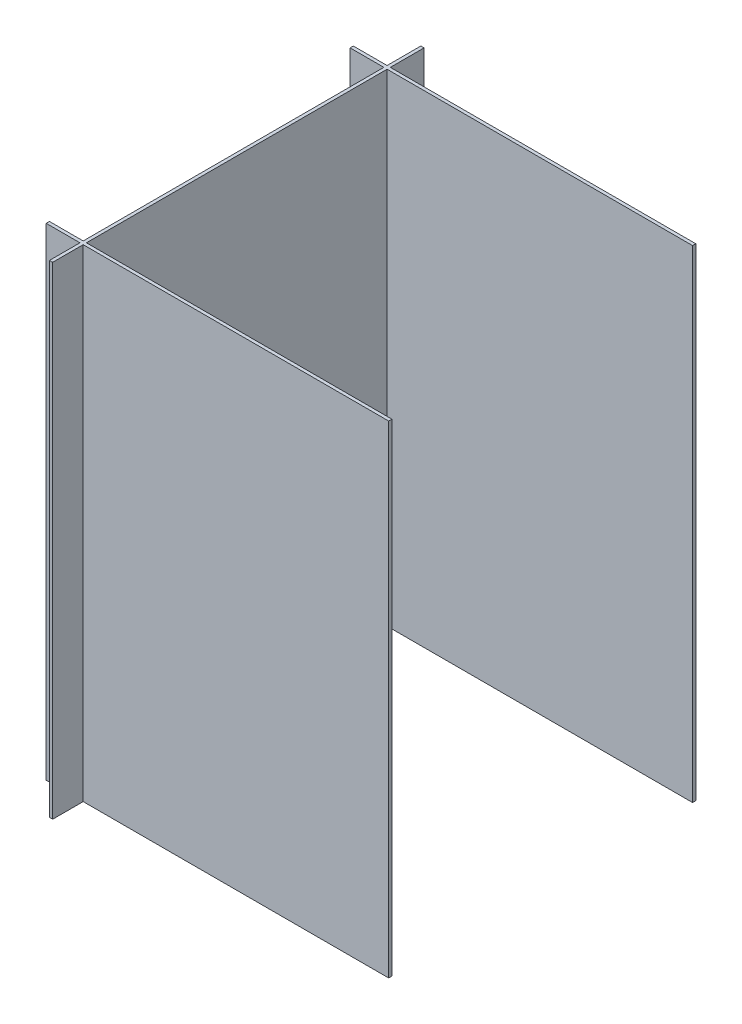
ISO-10303-21;
HEADER;
FILE_DESCRIPTION(('STEP AP214'),'2;1');
FILE_NAME('part.step','',(''),(''),'','','');
FILE_SCHEMA(('AUTOMOTIVE_DESIGN { 1 0 10303 214 1 1 1 1 }'));
ENDSEC;
DATA;
#1=APPLICATION_CONTEXT('core data for automotive mechanical design processes');
#2=APPLICATION_PROTOCOL_DEFINITION('international standard','automotive_design',2000,#1);
#3=PRODUCT_CONTEXT('',#1,'mechanical');
#4=PRODUCT('Part','Part','',(#3));
#5=PRODUCT_RELATED_PRODUCT_CATEGORY('part','',(#4));
#6=PRODUCT_DEFINITION_FORMATION('','',#4);
#7=PRODUCT_DEFINITION_CONTEXT('part definition',#1,'design');
#8=PRODUCT_DEFINITION('design','',#6,#7);
#9=PRODUCT_DEFINITION_SHAPE('','',#8);
#10=(LENGTH_UNIT() NAMED_UNIT(*) SI_UNIT(.MILLI.,.METRE.));
#11=(NAMED_UNIT(*) PLANE_ANGLE_UNIT() SI_UNIT($,.RADIAN.));
#12=(NAMED_UNIT(*) SI_UNIT($,.STERADIAN.) SOLID_ANGLE_UNIT());
#13=UNCERTAINTY_MEASURE_WITH_UNIT(LENGTH_MEASURE(1.E-05),#10,'distance_accuracy_value','');
#14=(GEOMETRIC_REPRESENTATION_CONTEXT(3) GLOBAL_UNCERTAINTY_ASSIGNED_CONTEXT((#13)) GLOBAL_UNIT_ASSIGNED_CONTEXT((#10,
#11,#12)) REPRESENTATION_CONTEXT('',''));
#15=CARTESIAN_POINT('',(0.,0.,0.));
#16=DIRECTION('',(0.,0.,1.));
#17=DIRECTION('',(1.,0.,0.));
#18=AXIS2_PLACEMENT_3D('',#15,#16,#17);
#19=CARTESIAN_POINT('',(-56.1616111521953,300.,42.3022668872637));
#20=DIRECTION('',(1.,0.,0.));
#21=DIRECTION('',(0.,0.,-1.));
#22=AXIS2_PLACEMENT_3D('',#19,#20,#21);
#23=PLANE('',#22);
#24=DIRECTION('',(0.,0.,1.));
#25=VECTOR('',#24,1.);
#26=CARTESIAN_POINT('',(-56.1616111521953,0.,42.3022668872637));
#27=LINE('',#26,#25);
#28=CARTESIAN_POINT('',(-56.1616111521953,0.,42.3022668872637));
#29=VERTEX_POINT('',#28);
#30=CARTESIAN_POINT('',(-56.1616111521953,0.,44.3022668872637));
#31=VERTEX_POINT('',#30);
#32=EDGE_CURVE('E214',#29,#31,#27,.T.);
#33=ORIENTED_EDGE('',*,*,#32,.T.);
#34=DIRECTION('',(0.,-1.,0.));
#35=VECTOR('',#34,1.);
#36=CARTESIAN_POINT('',(-56.1616111521953,300.,44.3022668872637));
#37=LINE('',#36,#35);
#38=CARTESIAN_POINT('',(-56.1616111521953,300.,44.3022668872637));
#39=VERTEX_POINT('',#38);
#40=EDGE_CURVE('E11',#39,#31,#37,.T.);
#41=ORIENTED_EDGE('',*,*,#40,.F.);
#42=DIRECTION('',(0.,0.,1.));
#43=VECTOR('',#42,1.);
#44=CARTESIAN_POINT('',(-56.1616111521953,300.,42.3022668872637));
#45=LINE('',#44,#43);
#46=CARTESIAN_POINT('',(-56.1616111521953,300.,42.3022668872637));
#47=VERTEX_POINT('',#46);
#48=EDGE_CURVE('E272',#47,#39,#45,.T.);
#49=ORIENTED_EDGE('',*,*,#48,.F.);
#50=DIRECTION('',(0.,-1.,0.));
#51=VECTOR('',#50,1.);
#52=CARTESIAN_POINT('',(-56.1616111521953,300.,42.3022668872637));
#53=LINE('',#52,#51);
#54=EDGE_CURVE('E210',#47,#29,#53,.T.);
#55=ORIENTED_EDGE('',*,*,#54,.T.);
#56=EDGE_LOOP('',(#33,#41,#49,#55));
#57=FACE_BOUND('',#56,.T.);
#58=ADVANCED_FACE('F41',(#57),#23,.F.);
#59=CARTESIAN_POINT('',(-56.1616111521953,300.,44.3022668872637));
#60=DIRECTION('',(0.,0.,-1.));
#61=DIRECTION('',(-1.,0.,0.));
#62=AXIS2_PLACEMENT_3D('',#59,#60,#61);
#63=PLANE('',#62);
#64=DIRECTION('',(1.,0.,0.));
#65=VECTOR('',#64,1.);
#66=CARTESIAN_POINT('',(-56.1616111521953,0.,44.3022668872637));
#67=LINE('',#66,#65);
#68=CARTESIAN_POINT('',(-35.1616111521953,0.,44.3022668872637));
#69=VERTEX_POINT('',#68);
#70=EDGE_CURVE('E218',#31,#69,#67,.T.);
#71=ORIENTED_EDGE('',*,*,#70,.T.);
#72=DIRECTION('',(0.,-1.,0.));
#73=VECTOR('',#72,1.);
#74=CARTESIAN_POINT('',(-35.1616111521953,300.,44.3022668872637));
#75=LINE('',#74,#73);
#76=CARTESIAN_POINT('',(-35.1616111521953,300.,44.3022668872637));
#77=VERTEX_POINT('',#76);
#78=EDGE_CURVE('E50',#77,#69,#75,.T.);
#79=ORIENTED_EDGE('',*,*,#78,.F.);
#80=DIRECTION('',(1.,0.,0.));
#81=VECTOR('',#80,1.);
#82=CARTESIAN_POINT('',(-56.1616111521953,300.,44.3022668872637));
#83=LINE('',#82,#81);
#84=EDGE_CURVE('E137',#39,#77,#83,.T.);
#85=ORIENTED_EDGE('',*,*,#84,.F.);
#86=ORIENTED_EDGE('',*,*,#40,.T.);
#87=EDGE_LOOP('',(#71,#79,#85,#86));
#88=FACE_BOUND('',#87,.T.);
#89=ADVANCED_FACE('F422',(#88),#63,.F.);
#90=CARTESIAN_POINT('',(-35.1616111521953,300.,44.3022668872637));
#91=DIRECTION('',(1.,0.,0.));
#92=DIRECTION('',(0.,0.,-1.));
#93=AXIS2_PLACEMENT_3D('',#90,#91,#92);
#94=PLANE('',#93);
#95=DIRECTION('',(0.,0.,1.));
#96=VECTOR('',#95,1.);
#97=CARTESIAN_POINT('',(-35.1616111521953,0.,44.3022668872637));
#98=LINE('',#97,#96);
#99=CARTESIAN_POINT('',(-35.1616111521953,0.,231.302266887264));
#100=VERTEX_POINT('',#99);
#101=EDGE_CURVE('E221',#69,#100,#98,.T.);
#102=ORIENTED_EDGE('',*,*,#101,.T.);
#103=DIRECTION('',(0.,-1.,0.));
#104=VECTOR('',#103,1.);
#105=CARTESIAN_POINT('',(-35.1616111521953,300.,231.302266887264));
#106=LINE('',#105,#104);
#107=CARTESIAN_POINT('',(-35.1616111521953,300.,231.302266887264));
#108=VERTEX_POINT('',#107);
#109=EDGE_CURVE('E331',#108,#100,#106,.T.);
#110=ORIENTED_EDGE('',*,*,#109,.F.);
#111=DIRECTION('',(0.,0.,1.));
#112=VECTOR('',#111,1.);
#113=CARTESIAN_POINT('',(-35.1616111521953,300.,44.3022668872637));
#114=LINE('',#113,#112);
#115=EDGE_CURVE('E341',#77,#108,#114,.T.);
#116=ORIENTED_EDGE('',*,*,#115,.F.);
#117=ORIENTED_EDGE('',*,*,#78,.T.);
#118=EDGE_LOOP('',(#102,#110,#116,#117));
#119=FACE_BOUND('',#118,.T.);
#120=ADVANCED_FACE('F339',(#119),#94,.F.);
#121=CARTESIAN_POINT('',(-35.1616111521953,300.,231.302266887264));
#122=DIRECTION('',(0.,0.,1.));
#123=DIRECTION('',(1.,0.,0.));
#124=AXIS2_PLACEMENT_3D('',#121,#122,#123);
#125=PLANE('',#124);
#126=DIRECTION('',(-1.,0.,0.));
#127=VECTOR('',#126,1.);
#128=CARTESIAN_POINT('',(-35.1616111521953,0.,231.302266887264));
#129=LINE('',#128,#127);
#130=CARTESIAN_POINT('',(-56.1616111521953,0.,231.302266887264));
#131=VERTEX_POINT('',#130);
#132=EDGE_CURVE('E224',#100,#131,#129,.T.);
#133=ORIENTED_EDGE('',*,*,#132,.T.);
#134=DIRECTION('',(0.,-1.,0.));
#135=VECTOR('',#134,1.);
#136=CARTESIAN_POINT('',(-56.1616111521953,300.,231.302266887264));
#137=LINE('',#136,#135);
#138=CARTESIAN_POINT('',(-56.1616111521953,300.,231.302266887264));
#139=VERTEX_POINT('',#138);
#140=EDGE_CURVE('E327',#139,#131,#137,.T.);
#141=ORIENTED_EDGE('',*,*,#140,.F.);
#142=DIRECTION('',(-1.,0.,0.));
#143=VECTOR('',#142,1.);
#144=CARTESIAN_POINT('',(-35.1616111521953,300.,231.302266887264));
#145=LINE('',#144,#143);
#146=EDGE_CURVE('E360',#108,#139,#145,.T.);
#147=ORIENTED_EDGE('',*,*,#146,.F.);
#148=ORIENTED_EDGE('',*,*,#109,.T.);
#149=EDGE_LOOP('',(#133,#141,#147,#148));
#150=FACE_BOUND('',#149,.T.);
#151=ADVANCED_FACE('F350',(#150),#125,.F.);
#152=CARTESIAN_POINT('',(-56.1616111521953,300.,231.302266887264));
#153=DIRECTION('',(1.,0.,0.));
#154=DIRECTION('',(0.,0.,-1.));
#155=AXIS2_PLACEMENT_3D('',#152,#153,#154);
#156=PLANE('',#155);
#157=DIRECTION('',(0.,0.,1.));
#158=VECTOR('',#157,1.);
#159=CARTESIAN_POINT('',(-56.1616111521953,0.,231.302266887264));
#160=LINE('',#159,#158);
#161=CARTESIAN_POINT('',(-56.1616111521953,0.,233.302266887264));
#162=VERTEX_POINT('',#161);
#163=EDGE_CURVE('E227',#131,#162,#160,.T.);
#164=ORIENTED_EDGE('',*,*,#163,.T.);
#165=DIRECTION('',(0.,-1.,0.));
#166=VECTOR('',#165,1.);
#167=CARTESIAN_POINT('',(-56.1616111521953,300.,233.302266887264));
#168=LINE('',#167,#166);
#169=CARTESIAN_POINT('',(-56.1616111521953,300.,233.302266887264));
#170=VERTEX_POINT('',#169);
#171=EDGE_CURVE('E323',#170,#162,#168,.T.);
#172=ORIENTED_EDGE('',*,*,#171,.F.);
#173=DIRECTION('',(0.,0.,1.));
#174=VECTOR('',#173,1.);
#175=CARTESIAN_POINT('',(-56.1616111521953,300.,231.302266887264));
#176=LINE('',#175,#174);
#177=EDGE_CURVE('E356',#139,#170,#176,.T.);
#178=ORIENTED_EDGE('',*,*,#177,.F.);
#179=ORIENTED_EDGE('',*,*,#140,.T.);
#180=EDGE_LOOP('',(#164,#172,#178,#179));
#181=FACE_BOUND('',#180,.T.);
#182=ADVANCED_FACE('F354',(#181),#156,.F.);
#183=CARTESIAN_POINT('',(-56.1616111521953,300.,233.302266887264));
#184=DIRECTION('',(0.,0.,-1.));
#185=DIRECTION('',(-1.,0.,0.));
#186=AXIS2_PLACEMENT_3D('',#183,#184,#185);
#187=PLANE('',#186);
#188=DIRECTION('',(1.,0.,0.));
#189=VECTOR('',#188,1.);
#190=CARTESIAN_POINT('',(-56.1616111521953,0.,233.302266887264));
#191=LINE('',#190,#189);
#192=CARTESIAN_POINT('',(-35.1616111521953,0.,233.302266887264));
#193=VERTEX_POINT('',#192);
#194=EDGE_CURVE('E230',#162,#193,#191,.T.);
#195=ORIENTED_EDGE('',*,*,#194,.T.);
#196=DIRECTION('',(0.,-1.,0.));
#197=VECTOR('',#196,1.);
#198=CARTESIAN_POINT('',(-35.1616111521953,300.,233.302266887264));
#199=LINE('',#198,#197);
#200=CARTESIAN_POINT('',(-35.1616111521953,300.,233.302266887264));
#201=VERTEX_POINT('',#200);
#202=EDGE_CURVE('E319',#201,#193,#199,.T.);
#203=ORIENTED_EDGE('',*,*,#202,.F.);
#204=DIRECTION('',(1.,0.,0.));
#205=VECTOR('',#204,1.);
#206=CARTESIAN_POINT('',(-56.1616111521953,300.,233.302266887264));
#207=LINE('',#206,#205);
#208=EDGE_CURVE('E359',#170,#201,#207,.T.);
#209=ORIENTED_EDGE('',*,*,#208,.F.);
#210=ORIENTED_EDGE('',*,*,#171,.T.);
#211=EDGE_LOOP('',(#195,#203,#209,#210));
#212=FACE_BOUND('',#211,.T.);
#213=ADVANCED_FACE('F435',(#212),#187,.F.);
#214=CARTESIAN_POINT('',(-35.1616111521953,300.,233.302266887264));
#215=DIRECTION('',(1.,0.,0.));
#216=DIRECTION('',(0.,0.,-1.));
#217=AXIS2_PLACEMENT_3D('',#214,#215,#216);
#218=PLANE('',#217);
#219=DIRECTION('',(0.,0.,1.));
#220=VECTOR('',#219,1.);
#221=CARTESIAN_POINT('',(-35.1616111521953,0.,233.302266887264));
#222=LINE('',#221,#220);
#223=CARTESIAN_POINT('',(-35.1616111521953,0.,252.302266887264));
#224=VERTEX_POINT('',#223);
#225=EDGE_CURVE('E233',#193,#224,#222,.T.);
#226=ORIENTED_EDGE('',*,*,#225,.T.);
#227=DIRECTION('',(0.,-1.,0.));
#228=VECTOR('',#227,1.);
#229=CARTESIAN_POINT('',(-35.1616111521953,300.,252.302266887264));
#230=LINE('',#229,#228);
#231=CARTESIAN_POINT('',(-35.1616111521953,300.,252.302266887264));
#232=VERTEX_POINT('',#231);
#233=EDGE_CURVE('E315',#232,#224,#230,.T.);
#234=ORIENTED_EDGE('',*,*,#233,.F.);
#235=DIRECTION('',(0.,0.,1.));
#236=VECTOR('',#235,1.);
#237=CARTESIAN_POINT('',(-35.1616111521953,300.,233.302266887264));
#238=LINE('',#237,#236);
#239=EDGE_CURVE('E364',#201,#232,#238,.T.);
#240=ORIENTED_EDGE('',*,*,#239,.F.);
#241=ORIENTED_EDGE('',*,*,#202,.T.);
#242=EDGE_LOOP('',(#226,#234,#240,#241));
#243=FACE_BOUND('',#242,.T.);
#244=ADVANCED_FACE('F438',(#243),#218,.F.);
#245=CARTESIAN_POINT('',(-35.1616111521953,300.,252.302266887264));
#246=DIRECTION('',(0.,0.,-1.));
#247=DIRECTION('',(-1.,0.,0.));
#248=AXIS2_PLACEMENT_3D('',#245,#246,#247);
#249=PLANE('',#248);
#250=DIRECTION('',(1.,0.,0.));
#251=VECTOR('',#250,1.);
#252=CARTESIAN_POINT('',(-35.1616111521953,0.,252.302266887264));
#253=LINE('',#252,#251);
#254=CARTESIAN_POINT('',(-33.1616111521953,0.,252.302266887264));
#255=VERTEX_POINT('',#254);
#256=EDGE_CURVE('E236',#224,#255,#253,.T.);
#257=ORIENTED_EDGE('',*,*,#256,.T.);
#258=DIRECTION('',(0.,-1.,0.));
#259=VECTOR('',#258,1.);
#260=CARTESIAN_POINT('',(-33.1616111521953,300.,252.302266887264));
#261=LINE('',#260,#259);
#262=CARTESIAN_POINT('',(-33.1616111521953,300.,252.302266887264));
#263=VERTEX_POINT('',#262);
#264=EDGE_CURVE('E311',#263,#255,#261,.T.);
#265=ORIENTED_EDGE('',*,*,#264,.F.);
#266=DIRECTION('',(1.,0.,0.));
#267=VECTOR('',#266,1.);
#268=CARTESIAN_POINT('',(-35.1616111521953,300.,252.302266887264));
#269=LINE('',#268,#267);
#270=EDGE_CURVE('E371',#232,#263,#269,.T.);
#271=ORIENTED_EDGE('',*,*,#270,.F.);
#272=ORIENTED_EDGE('',*,*,#233,.T.);
#273=EDGE_LOOP('',(#257,#265,#271,#272));
#274=FACE_BOUND('',#273,.T.);
#275=ADVANCED_FACE('F442',(#274),#249,.F.);
#276=CARTESIAN_POINT('',(-33.1616111521953,300.,233.302266887264));
#277=DIRECTION('',(-1.,0.,0.));
#278=DIRECTION('',(0.,0.,1.));
#279=AXIS2_PLACEMENT_3D('',#276,#277,#278);
#280=PLANE('',#279);
#281=DIRECTION('',(0.,0.,-1.));
#282=VECTOR('',#281,1.);
#283=CARTESIAN_POINT('',(-33.1616111521953,0.,233.302266887264));
#284=LINE('',#283,#282);
#285=CARTESIAN_POINT('',(-33.1616111521953,0.,233.302266887264));
#286=VERTEX_POINT('',#285);
#287=EDGE_CURVE('E239',#255,#286,#284,.T.);
#288=ORIENTED_EDGE('',*,*,#287,.T.);
#289=DIRECTION('',(0.,-1.,0.));
#290=VECTOR('',#289,1.);
#291=CARTESIAN_POINT('',(-33.1616111521953,300.,233.302266887264));
#292=LINE('',#291,#290);
#293=CARTESIAN_POINT('',(-33.1616111521953,300.,233.302266887264));
#294=VERTEX_POINT('',#293);
#295=EDGE_CURVE('E307',#294,#286,#292,.T.);
#296=ORIENTED_EDGE('',*,*,#295,.F.);
#297=DIRECTION('',(0.,0.,-1.));
#298=VECTOR('',#297,1.);
#299=CARTESIAN_POINT('',(-33.1616111521953,300.,233.302266887264));
#300=LINE('',#299,#298);
#301=EDGE_CURVE('E374',#263,#294,#300,.T.);
#302=ORIENTED_EDGE('',*,*,#301,.F.);
#303=ORIENTED_EDGE('',*,*,#264,.T.);
#304=EDGE_LOOP('',(#288,#296,#302,#303));
#305=FACE_BOUND('',#304,.T.);
#306=ADVANCED_FACE('F446',(#305),#280,.F.);
#307=CARTESIAN_POINT('',(-33.1616111521953,300.,233.302266887264));
#308=DIRECTION('',(0.,0.,-1.));
#309=DIRECTION('',(-1.,0.,0.));
#310=AXIS2_PLACEMENT_3D('',#307,#308,#309);
#311=PLANE('',#310);
#312=DIRECTION('',(1.,0.,0.));
#313=VECTOR('',#312,1.);
#314=CARTESIAN_POINT('',(-33.1616111521953,0.,233.302266887264));
#315=LINE('',#314,#313);
#316=CARTESIAN_POINT('',(156.838388847805,0.,233.302266887264));
#317=VERTEX_POINT('',#316);
#318=EDGE_CURVE('E242',#286,#317,#315,.T.);
#319=ORIENTED_EDGE('',*,*,#318,.T.);
#320=DIRECTION('',(0.,-1.,0.));
#321=VECTOR('',#320,1.);
#322=CARTESIAN_POINT('',(156.838388847805,300.,233.302266887264));
#323=LINE('',#322,#321);
#324=CARTESIAN_POINT('',(156.838388847805,300.,233.302266887264));
#325=VERTEX_POINT('',#324);
#326=EDGE_CURVE('E303',#325,#317,#323,.T.);
#327=ORIENTED_EDGE('',*,*,#326,.F.);
#328=DIRECTION('',(1.,0.,0.));
#329=VECTOR('',#328,1.);
#330=CARTESIAN_POINT('',(-33.1616111521953,300.,233.302266887264));
#331=LINE('',#330,#329);
#332=EDGE_CURVE('E377',#294,#325,#331,.T.);
#333=ORIENTED_EDGE('',*,*,#332,.F.);
#334=ORIENTED_EDGE('',*,*,#295,.T.);
#335=EDGE_LOOP('',(#319,#327,#333,#334));
#336=FACE_BOUND('',#335,.T.);
#337=ADVANCED_FACE('F450',(#336),#311,.F.);
#338=CARTESIAN_POINT('',(156.838388847805,300.,231.302266887264));
#339=DIRECTION('',(-1.,0.,0.));
#340=DIRECTION('',(0.,0.,1.));
#341=AXIS2_PLACEMENT_3D('',#338,#339,#340);
#342=PLANE('',#341);
#343=DIRECTION('',(0.,0.,-1.));
#344=VECTOR('',#343,1.);
#345=CARTESIAN_POINT('',(156.838388847805,0.,231.302266887264));
#346=LINE('',#345,#344);
#347=CARTESIAN_POINT('',(156.838388847805,0.,231.302266887264));
#348=VERTEX_POINT('',#347);
#349=EDGE_CURVE('E245',#317,#348,#346,.T.);
#350=ORIENTED_EDGE('',*,*,#349,.T.);
#351=DIRECTION('',(0.,-1.,0.));
#352=VECTOR('',#351,1.);
#353=CARTESIAN_POINT('',(156.838388847805,300.,231.302266887264));
#354=LINE('',#353,#352);
#355=CARTESIAN_POINT('',(156.838388847805,300.,231.302266887264));
#356=VERTEX_POINT('',#355);
#357=EDGE_CURVE('E299',#356,#348,#354,.T.);
#358=ORIENTED_EDGE('',*,*,#357,.F.);
#359=DIRECTION('',(0.,0.,-1.));
#360=VECTOR('',#359,1.);
#361=CARTESIAN_POINT('',(156.838388847805,300.,231.302266887264));
#362=LINE('',#361,#360);
#363=EDGE_CURVE('E380',#325,#356,#362,.T.);
#364=ORIENTED_EDGE('',*,*,#363,.F.);
#365=ORIENTED_EDGE('',*,*,#326,.T.);
#366=EDGE_LOOP('',(#350,#358,#364,#365));
#367=FACE_BOUND('',#366,.T.);
#368=ADVANCED_FACE('F454',(#367),#342,.F.);
#369=CARTESIAN_POINT('',(-33.1616111521953,300.,231.302266887264));
#370=DIRECTION('',(0.,0.,1.));
#371=DIRECTION('',(1.,0.,0.));
#372=AXIS2_PLACEMENT_3D('',#369,#370,#371);
#373=PLANE('',#372);
#374=DIRECTION('',(-1.,0.,0.));
#375=VECTOR('',#374,1.);
#376=CARTESIAN_POINT('',(-33.1616111521953,0.,231.302266887264));
#377=LINE('',#376,#375);
#378=CARTESIAN_POINT('',(-33.1616111521953,0.,231.302266887264));
#379=VERTEX_POINT('',#378);
#380=EDGE_CURVE('E248',#348,#379,#377,.T.);
#381=ORIENTED_EDGE('',*,*,#380,.T.);
#382=DIRECTION('',(0.,-1.,0.));
#383=VECTOR('',#382,1.);
#384=CARTESIAN_POINT('',(-33.1616111521953,300.,231.302266887264));
#385=LINE('',#384,#383);
#386=CARTESIAN_POINT('',(-33.1616111521953,300.,231.302266887264));
#387=VERTEX_POINT('',#386);
#388=EDGE_CURVE('E295',#387,#379,#385,.T.);
#389=ORIENTED_EDGE('',*,*,#388,.F.);
#390=DIRECTION('',(-1.,0.,0.));
#391=VECTOR('',#390,1.);
#392=CARTESIAN_POINT('',(-33.1616111521953,300.,231.302266887264));
#393=LINE('',#392,#391);
#394=EDGE_CURVE('E383',#356,#387,#393,.T.);
#395=ORIENTED_EDGE('',*,*,#394,.F.);
#396=ORIENTED_EDGE('',*,*,#357,.T.);
#397=EDGE_LOOP('',(#381,#389,#395,#396));
#398=FACE_BOUND('',#397,.T.);
#399=ADVANCED_FACE('F458',(#398),#373,.F.);
#400=CARTESIAN_POINT('',(-33.1616111521953,300.,44.3022668872637));
#401=DIRECTION('',(-1.,0.,0.));
#402=DIRECTION('',(0.,0.,1.));
#403=AXIS2_PLACEMENT_3D('',#400,#401,#402);
#404=PLANE('',#403);
#405=DIRECTION('',(0.,0.,-1.));
#406=VECTOR('',#405,1.);
#407=CARTESIAN_POINT('',(-33.1616111521953,0.,44.3022668872637));
#408=LINE('',#407,#406);
#409=CARTESIAN_POINT('',(-33.1616111521953,0.,44.3022668872637));
#410=VERTEX_POINT('',#409);
#411=EDGE_CURVE('E251',#379,#410,#408,.T.);
#412=ORIENTED_EDGE('',*,*,#411,.T.);
#413=DIRECTION('',(0.,-1.,0.));
#414=VECTOR('',#413,1.);
#415=CARTESIAN_POINT('',(-33.1616111521953,300.,44.3022668872637));
#416=LINE('',#415,#414);
#417=CARTESIAN_POINT('',(-33.1616111521953,300.,44.3022668872637));
#418=VERTEX_POINT('',#417);
#419=EDGE_CURVE('E291',#418,#410,#416,.T.);
#420=ORIENTED_EDGE('',*,*,#419,.F.);
#421=DIRECTION('',(0.,0.,-1.));
#422=VECTOR('',#421,1.);
#423=CARTESIAN_POINT('',(-33.1616111521953,300.,44.3022668872637));
#424=LINE('',#423,#422);
#425=EDGE_CURVE('E386',#387,#418,#424,.T.);
#426=ORIENTED_EDGE('',*,*,#425,.F.);
#427=ORIENTED_EDGE('',*,*,#388,.T.);
#428=EDGE_LOOP('',(#412,#420,#426,#427));
#429=FACE_BOUND('',#428,.T.);
#430=ADVANCED_FACE('F462',(#429),#404,.F.);
#431=CARTESIAN_POINT('',(-33.1616111521953,300.,44.3022668872637));
#432=DIRECTION('',(0.,0.,-1.));
#433=DIRECTION('',(-1.,0.,0.));
#434=AXIS2_PLACEMENT_3D('',#431,#432,#433);
#435=PLANE('',#434);
#436=DIRECTION('',(1.,0.,0.));
#437=VECTOR('',#436,1.);
#438=CARTESIAN_POINT('',(-33.1616111521953,0.,44.3022668872637));
#439=LINE('',#438,#437);
#440=CARTESIAN_POINT('',(156.838388847805,0.,44.3022668872637));
#441=VERTEX_POINT('',#440);
#442=EDGE_CURVE('E254',#410,#441,#439,.T.);
#443=ORIENTED_EDGE('',*,*,#442,.T.);
#444=DIRECTION('',(0.,-1.,0.));
#445=VECTOR('',#444,1.);
#446=CARTESIAN_POINT('',(156.838388847805,300.,44.3022668872637));
#447=LINE('',#446,#445);
#448=CARTESIAN_POINT('',(156.838388847805,300.,44.3022668872637));
#449=VERTEX_POINT('',#448);
#450=EDGE_CURVE('E287',#449,#441,#447,.T.);
#451=ORIENTED_EDGE('',*,*,#450,.F.);
#452=DIRECTION('',(1.,0.,0.));
#453=VECTOR('',#452,1.);
#454=CARTESIAN_POINT('',(-33.1616111521953,300.,44.3022668872637));
#455=LINE('',#454,#453);
#456=EDGE_CURVE('E389',#418,#449,#455,.T.);
#457=ORIENTED_EDGE('',*,*,#456,.F.);
#458=ORIENTED_EDGE('',*,*,#419,.T.);
#459=EDGE_LOOP('',(#443,#451,#457,#458));
#460=FACE_BOUND('',#459,.T.);
#461=ADVANCED_FACE('F466',(#460),#435,.F.);
#462=CARTESIAN_POINT('',(156.838388847805,300.,42.3022668872637));
#463=DIRECTION('',(-1.,0.,0.));
#464=DIRECTION('',(0.,0.,1.));
#465=AXIS2_PLACEMENT_3D('',#462,#463,#464);
#466=PLANE('',#465);
#467=DIRECTION('',(0.,0.,-1.));
#468=VECTOR('',#467,1.);
#469=CARTESIAN_POINT('',(156.838388847805,0.,42.3022668872637));
#470=LINE('',#469,#468);
#471=CARTESIAN_POINT('',(156.838388847805,0.,42.3022668872637));
#472=VERTEX_POINT('',#471);
#473=EDGE_CURVE('E257',#441,#472,#470,.T.);
#474=ORIENTED_EDGE('',*,*,#473,.T.);
#475=DIRECTION('',(0.,-1.,0.));
#476=VECTOR('',#475,1.);
#477=CARTESIAN_POINT('',(156.838388847805,300.,42.3022668872637));
#478=LINE('',#477,#476);
#479=CARTESIAN_POINT('',(156.838388847805,300.,42.3022668872637));
#480=VERTEX_POINT('',#479);
#481=EDGE_CURVE('E283',#480,#472,#478,.T.);
#482=ORIENTED_EDGE('',*,*,#481,.F.);
#483=DIRECTION('',(0.,0.,-1.));
#484=VECTOR('',#483,1.);
#485=CARTESIAN_POINT('',(156.838388847805,300.,42.3022668872637));
#486=LINE('',#485,#484);
#487=EDGE_CURVE('E392',#449,#480,#486,.T.);
#488=ORIENTED_EDGE('',*,*,#487,.F.);
#489=ORIENTED_EDGE('',*,*,#450,.T.);
#490=EDGE_LOOP('',(#474,#482,#488,#489));
#491=FACE_BOUND('',#490,.T.);
#492=ADVANCED_FACE('F470',(#491),#466,.F.);
#493=CARTESIAN_POINT('',(-33.1616111521953,300.,42.3022668872637));
#494=DIRECTION('',(0.,0.,1.));
#495=DIRECTION('',(1.,0.,0.));
#496=AXIS2_PLACEMENT_3D('',#493,#494,#495);
#497=PLANE('',#496);
#498=DIRECTION('',(-1.,0.,0.));
#499=VECTOR('',#498,1.);
#500=CARTESIAN_POINT('',(-33.1616111521953,0.,42.3022668872637));
#501=LINE('',#500,#499);
#502=CARTESIAN_POINT('',(-33.1616111521953,0.,42.3022668872637));
#503=VERTEX_POINT('',#502);
#504=EDGE_CURVE('E260',#472,#503,#501,.T.);
#505=ORIENTED_EDGE('',*,*,#504,.T.);
#506=DIRECTION('',(0.,-1.,0.));
#507=VECTOR('',#506,1.);
#508=CARTESIAN_POINT('',(-33.1616111521953,300.,42.3022668872637));
#509=LINE('',#508,#507);
#510=CARTESIAN_POINT('',(-33.1616111521953,300.,42.3022668872637));
#511=VERTEX_POINT('',#510);
#512=EDGE_CURVE('E279',#511,#503,#509,.T.);
#513=ORIENTED_EDGE('',*,*,#512,.F.);
#514=DIRECTION('',(-1.,0.,0.));
#515=VECTOR('',#514,1.);
#516=CARTESIAN_POINT('',(-33.1616111521953,300.,42.3022668872637));
#517=LINE('',#516,#515);
#518=EDGE_CURVE('E395',#480,#511,#517,.T.);
#519=ORIENTED_EDGE('',*,*,#518,.F.);
#520=ORIENTED_EDGE('',*,*,#481,.T.);
#521=EDGE_LOOP('',(#505,#513,#519,#520));
#522=FACE_BOUND('',#521,.T.);
#523=ADVANCED_FACE('F403',(#522),#497,.F.);
#524=CARTESIAN_POINT('',(-33.1616111521953,300.,42.3022668872637));
#525=DIRECTION('',(-1.,0.,0.));
#526=DIRECTION('',(0.,0.,1.));
#527=AXIS2_PLACEMENT_3D('',#524,#525,#526);
#528=PLANE('',#527);
#529=DIRECTION('',(0.,0.,-1.));
#530=VECTOR('',#529,1.);
#531=CARTESIAN_POINT('',(-33.1616111521953,0.,42.3022668872637));
#532=LINE('',#531,#530);
#533=CARTESIAN_POINT('',(-33.1616111521953,0.,21.3022668872637));
#534=VERTEX_POINT('',#533);
#535=EDGE_CURVE('E263',#503,#534,#532,.T.);
#536=ORIENTED_EDGE('',*,*,#535,.T.);
#537=DIRECTION('',(0.,-1.,0.));
#538=VECTOR('',#537,1.);
#539=CARTESIAN_POINT('',(-33.1616111521953,300.,21.3022668872637));
#540=LINE('',#539,#538);
#541=CARTESIAN_POINT('',(-33.1616111521953,300.,21.3022668872637));
#542=VERTEX_POINT('',#541);
#543=EDGE_CURVE('E203',#542,#534,#540,.T.);
#544=ORIENTED_EDGE('',*,*,#543,.F.);
#545=DIRECTION('',(0.,0.,-1.));
#546=VECTOR('',#545,1.);
#547=CARTESIAN_POINT('',(-33.1616111521953,300.,42.3022668872637));
#548=LINE('',#547,#546);
#549=EDGE_CURVE('E192',#511,#542,#548,.T.);
#550=ORIENTED_EDGE('',*,*,#549,.F.);
#551=ORIENTED_EDGE('',*,*,#512,.T.);
#552=EDGE_LOOP('',(#536,#544,#550,#551));
#553=FACE_BOUND('',#552,.T.);
#554=ADVANCED_FACE('F407',(#553),#528,.F.);
#555=CARTESIAN_POINT('',(-35.1616111521953,300.,21.3022668872637));
#556=DIRECTION('',(0.,0.,1.));
#557=DIRECTION('',(1.,0.,0.));
#558=AXIS2_PLACEMENT_3D('',#555,#556,#557);
#559=PLANE('',#558);
#560=DIRECTION('',(-1.,0.,0.));
#561=VECTOR('',#560,1.);
#562=CARTESIAN_POINT('',(-35.1616111521953,0.,21.3022668872637));
#563=LINE('',#562,#561);
#564=CARTESIAN_POINT('',(-35.1616111521953,0.,21.3022668872637));
#565=VERTEX_POINT('',#564);
#566=EDGE_CURVE('E201',#534,#565,#563,.T.);
#567=ORIENTED_EDGE('',*,*,#566,.T.);
#568=DIRECTION('',(0.,-1.,0.));
#569=VECTOR('',#568,1.);
#570=CARTESIAN_POINT('',(-35.1616111521953,300.,21.3022668872637));
#571=LINE('',#570,#569);
#572=CARTESIAN_POINT('',(-35.1616111521953,300.,21.3022668872637));
#573=VERTEX_POINT('',#572);
#574=EDGE_CURVE('E198',#573,#565,#571,.T.);
#575=ORIENTED_EDGE('',*,*,#574,.F.);
#576=DIRECTION('',(-1.,0.,0.));
#577=VECTOR('',#576,1.);
#578=CARTESIAN_POINT('',(-35.1616111521953,300.,21.3022668872637));
#579=LINE('',#578,#577);
#580=EDGE_CURVE('E186',#542,#573,#579,.T.);
#581=ORIENTED_EDGE('',*,*,#580,.F.);
#582=ORIENTED_EDGE('',*,*,#543,.T.);
#583=EDGE_LOOP('',(#567,#575,#581,#582));
#584=FACE_BOUND('',#583,.T.);
#585=ADVANCED_FACE('F199',(#584),#559,.F.);
#586=CARTESIAN_POINT('',(-35.1616111521953,300.,42.3022668872637));
#587=DIRECTION('',(1.,0.,0.));
#588=DIRECTION('',(0.,0.,-1.));
#589=AXIS2_PLACEMENT_3D('',#586,#587,#588);
#590=PLANE('',#589);
#591=DIRECTION('',(0.,0.,1.));
#592=VECTOR('',#591,1.);
#593=CARTESIAN_POINT('',(-35.1616111521953,0.,42.3022668872637));
#594=LINE('',#593,#592);
#595=CARTESIAN_POINT('',(-35.1616111521953,0.,42.3022668872637));
#596=VERTEX_POINT('',#595);
#597=EDGE_CURVE('E123',#565,#596,#594,.T.);
#598=ORIENTED_EDGE('',*,*,#597,.T.);
#599=DIRECTION('',(0.,-1.,0.));
#600=VECTOR('',#599,1.);
#601=CARTESIAN_POINT('',(-35.1616111521953,300.,42.3022668872637));
#602=LINE('',#601,#600);
#603=CARTESIAN_POINT('',(-35.1616111521953,300.,42.3022668872637));
#604=VERTEX_POINT('',#603);
#605=EDGE_CURVE('E204',#604,#596,#602,.T.);
#606=ORIENTED_EDGE('',*,*,#605,.F.);
#607=DIRECTION('',(0.,0.,1.));
#608=VECTOR('',#607,1.);
#609=CARTESIAN_POINT('',(-35.1616111521953,300.,42.3022668872637));
#610=LINE('',#609,#608);
#611=EDGE_CURVE('E190',#573,#604,#610,.T.);
#612=ORIENTED_EDGE('',*,*,#611,.F.);
#613=ORIENTED_EDGE('',*,*,#574,.T.);
#614=EDGE_LOOP('',(#598,#606,#612,#613));
#615=FACE_BOUND('',#614,.T.);
#616=ADVANCED_FACE('F206',(#615),#590,.F.);
#617=CARTESIAN_POINT('',(-56.1616111521953,300.,42.3022668872637));
#618=DIRECTION('',(0.,0.,1.));
#619=DIRECTION('',(1.,0.,0.));
#620=AXIS2_PLACEMENT_3D('',#617,#618,#619);
#621=PLANE('',#620);
#622=DIRECTION('',(-1.,0.,0.));
#623=VECTOR('',#622,1.);
#624=CARTESIAN_POINT('',(-56.1616111521953,0.,42.3022668872637));
#625=LINE('',#624,#623);
#626=EDGE_CURVE('E129',#596,#29,#625,.T.);
#627=ORIENTED_EDGE('',*,*,#626,.T.);
#628=ORIENTED_EDGE('',*,*,#54,.F.);
#629=DIRECTION('',(-1.,0.,0.));
#630=VECTOR('',#629,1.);
#631=CARTESIAN_POINT('',(-56.1616111521953,300.,42.3022668872637));
#632=LINE('',#631,#630);
#633=EDGE_CURVE('E58',#604,#47,#632,.T.);
#634=ORIENTED_EDGE('',*,*,#633,.F.);
#635=ORIENTED_EDGE('',*,*,#605,.T.);
#636=EDGE_LOOP('',(#627,#628,#634,#635));
#637=FACE_BOUND('',#636,.T.);
#638=ADVANCED_FACE('F411',(#637),#621,.F.);
#639=CARTESIAN_POINT('',(0.,300.,0.));
#640=DIRECTION('',(0.,1.,0.));
#641=DIRECTION('',(0.,0.,1.));
#642=AXIS2_PLACEMENT_3D('',#639,#640,#641);
#643=PLANE('',#642);
#644=ORIENTED_EDGE('',*,*,#48,.T.);
#645=ORIENTED_EDGE('',*,*,#84,.T.);
#646=ORIENTED_EDGE('',*,*,#115,.T.);
#647=ORIENTED_EDGE('',*,*,#146,.T.);
#648=ORIENTED_EDGE('',*,*,#177,.T.);
#649=ORIENTED_EDGE('',*,*,#208,.T.);
#650=ORIENTED_EDGE('',*,*,#239,.T.);
#651=ORIENTED_EDGE('',*,*,#270,.T.);
#652=ORIENTED_EDGE('',*,*,#301,.T.);
#653=ORIENTED_EDGE('',*,*,#332,.T.);
#654=ORIENTED_EDGE('',*,*,#363,.T.);
#655=ORIENTED_EDGE('',*,*,#394,.T.);
#656=ORIENTED_EDGE('',*,*,#425,.T.);
#657=ORIENTED_EDGE('',*,*,#456,.T.);
#658=ORIENTED_EDGE('',*,*,#487,.T.);
#659=ORIENTED_EDGE('',*,*,#518,.T.);
#660=ORIENTED_EDGE('',*,*,#549,.T.);
#661=ORIENTED_EDGE('',*,*,#580,.T.);
#662=ORIENTED_EDGE('',*,*,#611,.T.);
#663=ORIENTED_EDGE('',*,*,#633,.T.);
#664=EDGE_LOOP('',(#644,#645,#646,#647,#648,#649,#650,#651,#652,#653,#654,#655,#656,#657,#658,
#659,#660,#661,#662,#663));
#665=FACE_BOUND('',#664,.T.);
#666=ADVANCED_FACE('F188',(#665),#643,.T.);
#667=CARTESIAN_POINT('',(0.,0.,0.));
#668=DIRECTION('',(0.,1.,0.));
#669=DIRECTION('',(0.,0.,1.));
#670=AXIS2_PLACEMENT_3D('',#667,#668,#669);
#671=PLANE('',#670);
#672=ORIENTED_EDGE('',*,*,#32,.F.);
#673=ORIENTED_EDGE('',*,*,#626,.F.);
#674=ORIENTED_EDGE('',*,*,#597,.F.);
#675=ORIENTED_EDGE('',*,*,#566,.F.);
#676=ORIENTED_EDGE('',*,*,#535,.F.);
#677=ORIENTED_EDGE('',*,*,#504,.F.);
#678=ORIENTED_EDGE('',*,*,#473,.F.);
#679=ORIENTED_EDGE('',*,*,#442,.F.);
#680=ORIENTED_EDGE('',*,*,#411,.F.);
#681=ORIENTED_EDGE('',*,*,#380,.F.);
#682=ORIENTED_EDGE('',*,*,#349,.F.);
#683=ORIENTED_EDGE('',*,*,#318,.F.);
#684=ORIENTED_EDGE('',*,*,#287,.F.);
#685=ORIENTED_EDGE('',*,*,#256,.F.);
#686=ORIENTED_EDGE('',*,*,#225,.F.);
#687=ORIENTED_EDGE('',*,*,#194,.F.);
#688=ORIENTED_EDGE('',*,*,#163,.F.);
#689=ORIENTED_EDGE('',*,*,#132,.F.);
#690=ORIENTED_EDGE('',*,*,#101,.F.);
#691=ORIENTED_EDGE('',*,*,#70,.F.);
#692=EDGE_LOOP('',(#672,#673,#674,#675,#676,#677,#678,#679,#680,#681,#682,#683,#684,#685,#686,
#687,#688,#689,#690,#691));
#693=FACE_BOUND('',#692,.T.);
#694=ADVANCED_FACE('F345',(#693),#671,.F.);
#695=CLOSED_SHELL('',(#58,#89,#120,#151,#182,#213,#244,#275,#306,#337,#368,#399,#430,#461,#492,
#523,#554,#585,#616,#638,#666,#694));
#696=MANIFOLD_SOLID_BREP('B2',#695);
#697=ADVANCED_BREP_SHAPE_REPRESENTATION('',(#18,#696),#14);
#698=SHAPE_DEFINITION_REPRESENTATION(#9,#697);
ENDSEC;
END-ISO-10303-21;
